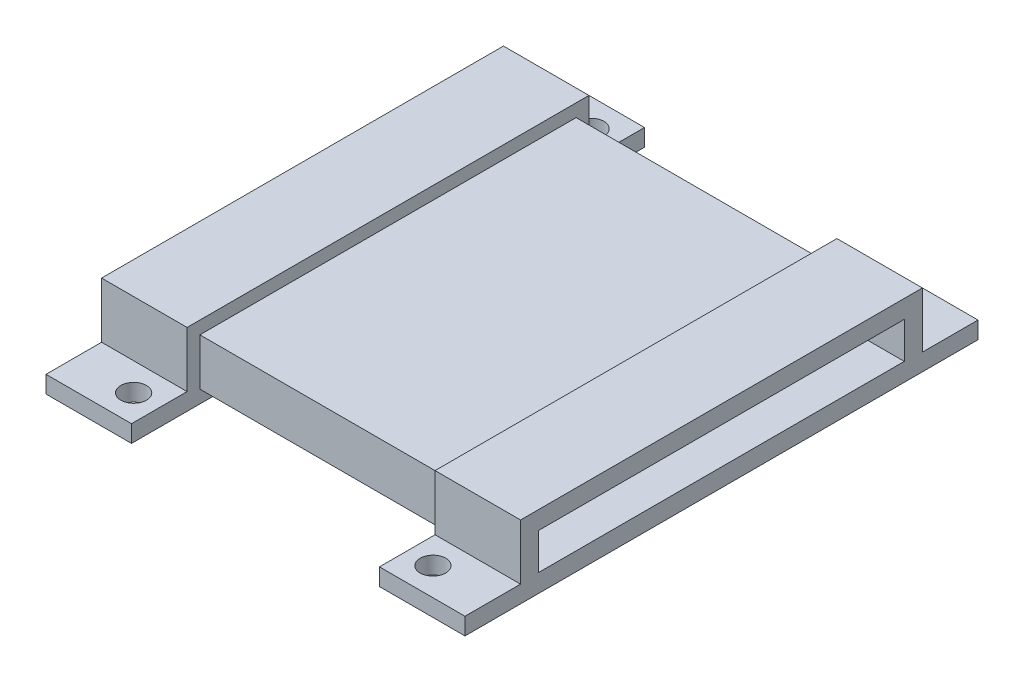
ISO-10303-21;
HEADER;
FILE_DESCRIPTION(('STEP AP214'),'2;1');
FILE_NAME('part.step','',(''),(''),'','','');
FILE_SCHEMA(('AUTOMOTIVE_DESIGN { 1 0 10303 214 1 1 1 1 }'));
ENDSEC;
DATA;
#1=APPLICATION_CONTEXT('core data for automotive mechanical design processes');
#2=APPLICATION_PROTOCOL_DEFINITION('international standard','automotive_design',2000,#1);
#3=PRODUCT_CONTEXT('',#1,'mechanical');
#4=PRODUCT('Part','Part','',(#3));
#5=PRODUCT_RELATED_PRODUCT_CATEGORY('part','',(#4));
#6=PRODUCT_DEFINITION_FORMATION('','',#4);
#7=PRODUCT_DEFINITION_CONTEXT('part definition',#1,'design');
#8=PRODUCT_DEFINITION('design','',#6,#7);
#9=PRODUCT_DEFINITION_SHAPE('','',#8);
#10=(LENGTH_UNIT() NAMED_UNIT(*) SI_UNIT(.MILLI.,.METRE.));
#11=(NAMED_UNIT(*) PLANE_ANGLE_UNIT() SI_UNIT($,.RADIAN.));
#12=(NAMED_UNIT(*) SI_UNIT($,.STERADIAN.) SOLID_ANGLE_UNIT());
#13=UNCERTAINTY_MEASURE_WITH_UNIT(LENGTH_MEASURE(1.E-05),#10,'distance_accuracy_value','');
#14=(GEOMETRIC_REPRESENTATION_CONTEXT(3) GLOBAL_UNCERTAINTY_ASSIGNED_CONTEXT((#13)) GLOBAL_UNIT_ASSIGNED_CONTEXT((#10,
#11,#12)) REPRESENTATION_CONTEXT('',''));
#15=CARTESIAN_POINT('',(0.,0.,0.));
#16=DIRECTION('',(0.,0.,1.));
#17=DIRECTION('',(1.,0.,0.));
#18=AXIS2_PLACEMENT_3D('',#15,#16,#17);
#19=CARTESIAN_POINT('',(-52.3559533834828,15.,-34.4979265643678));
#20=DIRECTION('',(0.,0.,1.));
#21=DIRECTION('',(1.,0.,0.));
#22=AXIS2_PLACEMENT_3D('',#19,#20,#21);
#23=PLANE('',#22);
#24=DIRECTION('',(0.,1.,0.));
#25=VECTOR('',#24,1.);
#26=CARTESIAN_POINT('',(-13.3559533834828,15.,-34.4979265643678));
#27=LINE('',#26,#25);
#28=CARTESIAN_POINT('',(-13.3559533834828,0.,-34.4979265643679));
#29=VERTEX_POINT('',#28);
#30=CARTESIAN_POINT('',(-13.3559533834828,2.,-34.4979265643678));
#31=VERTEX_POINT('',#30);
#32=EDGE_CURVE('E240',#29,#31,#27,.T.);
#33=ORIENTED_EDGE('',*,*,#32,.T.);
#34=DIRECTION('',(-1.,0.,0.));
#35=VECTOR('',#34,1.);
#36=CARTESIAN_POINT('',(1.64404661651728,2.,-34.4979265643678));
#37=LINE('',#36,#35);
#38=CARTESIAN_POINT('',(-3.35595338348275,2.,-34.4979265643678));
#39=VERTEX_POINT('',#38);
#40=EDGE_CURVE('E344',#39,#31,#37,.T.);
#41=ORIENTED_EDGE('',*,*,#40,.F.);
#42=DIRECTION('',(0.,-1.,0.));
#43=VECTOR('',#42,1.);
#44=CARTESIAN_POINT('',(-3.35595338348275,15.,-34.4979265643678));
#45=LINE('',#44,#43);
#46=CARTESIAN_POINT('',(-3.35595338348275,0.,-34.4979265643678));
#47=VERTEX_POINT('',#46);
#48=EDGE_CURVE('E369',#39,#47,#45,.T.);
#49=ORIENTED_EDGE('',*,*,#48,.T.);
#50=DIRECTION('',(-1.,0.,0.));
#51=VECTOR('',#50,1.);
#52=CARTESIAN_POINT('',(-52.3559533834828,0.,-34.4979265643678));
#53=LINE('',#52,#51);
#54=EDGE_CURVE('E363',#47,#29,#53,.T.);
#55=ORIENTED_EDGE('',*,*,#54,.T.);
#56=EDGE_LOOP('',(#33,#41,#49,#55));
#57=FACE_BOUND('',#56,.T.);
#58=ADVANCED_FACE('F30',(#57),#23,.F.);
#59=CARTESIAN_POINT('',(1.64404661651728,2.,-34.4979265643678));
#60=DIRECTION('',(0.,-1.,0.));
#61=DIRECTION('',(0.,0.,-1.));
#62=AXIS2_PLACEMENT_3D('',#59,#60,#61);
#63=PLANE('',#62);
#64=CARTESIAN_POINT('',(-10.3559533834828,2.,-31.2479265643678));
#65=DIRECTION('',(0.,-1.,0.));
#66=DIRECTION('',(0.,0.,-1.));
#67=AXIS2_PLACEMENT_3D('',#64,#65,#66);
#68=CIRCLE('',#67,1.5);
#69=CARTESIAN_POINT('',(-10.3559533834828,2.,-32.7479265643678));
#70=VERTEX_POINT('',#69);
#71=EDGE_CURVE('E322',#70,#70,#68,.T.);
#72=ORIENTED_EDGE('',*,*,#71,.T.);
#73=EDGE_LOOP('',(#72));
#74=FACE_BOUND('',#73,.T.);
#75=ORIENTED_EDGE('',*,*,#40,.T.);
#76=DIRECTION('',(0.,0.,-1.));
#77=VECTOR('',#76,1.);
#78=CARTESIAN_POINT('',(-13.3559533834828,2.,-27.4979265643678));
#79=LINE('',#78,#77);
#80=CARTESIAN_POINT('',(-13.3559533834828,2.,-27.9979265643678));
#81=VERTEX_POINT('',#80);
#82=EDGE_CURVE('E219',#81,#31,#79,.T.);
#83=ORIENTED_EDGE('',*,*,#82,.F.);
#84=DIRECTION('',(-1.,0.,0.));
#85=VECTOR('',#84,1.);
#86=CARTESIAN_POINT('',(1.64404661651728,2.,-27.9979265643678));
#87=LINE('',#86,#85);
#88=CARTESIAN_POINT('',(-3.35595338348275,2.,-27.9979265643678));
#89=VERTEX_POINT('',#88);
#90=EDGE_CURVE('E339',#89,#81,#87,.T.);
#91=ORIENTED_EDGE('',*,*,#90,.F.);
#92=DIRECTION('',(0.,0.,1.));
#93=VECTOR('',#92,1.);
#94=CARTESIAN_POINT('',(-3.35595338348275,2.,25.5020734356322));
#95=LINE('',#94,#93);
#96=EDGE_CURVE('E349',#39,#89,#95,.T.);
#97=ORIENTED_EDGE('',*,*,#96,.F.);
#98=EDGE_LOOP('',(#75,#83,#91,#97));
#99=FACE_BOUND('',#98,.T.);
#100=ADVANCED_FACE('F415',(#74,#99),#63,.F.);
#101=CARTESIAN_POINT('',(-52.3559533834828,15.,25.5020734356322));
#102=DIRECTION('',(0.,0.,-1.));
#103=DIRECTION('',(-1.,0.,0.));
#104=AXIS2_PLACEMENT_3D('',#101,#102,#103);
#105=PLANE('',#104);
#106=DIRECTION('',(0.,1.,0.));
#107=VECTOR('',#106,1.);
#108=CARTESIAN_POINT('',(-42.3559533834828,15.,25.5020734356322));
#109=LINE('',#108,#107);
#110=CARTESIAN_POINT('',(-42.3559533834828,0.,25.5020734356322));
#111=VERTEX_POINT('',#110);
#112=CARTESIAN_POINT('',(-42.3559533834828,2.,25.5020734356322));
#113=VERTEX_POINT('',#112);
#114=EDGE_CURVE('E249',#111,#113,#109,.T.);
#115=ORIENTED_EDGE('',*,*,#114,.T.);
#116=DIRECTION('',(-1.,0.,0.));
#117=VECTOR('',#116,1.);
#118=CARTESIAN_POINT('',(1.64404661651728,2.,25.5020734356322));
#119=LINE('',#118,#117);
#120=CARTESIAN_POINT('',(-52.3559533834828,2.,25.5020734356322));
#121=VERTEX_POINT('',#120);
#122=EDGE_CURVE('E310',#113,#121,#119,.T.);
#123=ORIENTED_EDGE('',*,*,#122,.T.);
#124=DIRECTION('',(0.,-1.,0.));
#125=VECTOR('',#124,1.);
#126=CARTESIAN_POINT('',(-52.3559533834828,15.,25.5020734356322));
#127=LINE('',#126,#125);
#128=CARTESIAN_POINT('',(-52.3559533834828,0.,25.5020734356322));
#129=VERTEX_POINT('',#128);
#130=EDGE_CURVE('E374',#121,#129,#127,.T.);
#131=ORIENTED_EDGE('',*,*,#130,.T.);
#132=DIRECTION('',(1.,0.,0.));
#133=VECTOR('',#132,1.);
#134=CARTESIAN_POINT('',(-52.3559533834828,0.,25.5020734356322));
#135=LINE('',#134,#133);
#136=EDGE_CURVE('E356',#129,#111,#135,.T.);
#137=ORIENTED_EDGE('',*,*,#136,.T.);
#138=EDGE_LOOP('',(#115,#123,#131,#137));
#139=FACE_BOUND('',#138,.T.);
#140=ADVANCED_FACE('F422',(#139),#105,.F.);
#141=CARTESIAN_POINT('',(1.64404661651728,2.,25.5020734356322));
#142=DIRECTION('',(0.,-1.,0.));
#143=DIRECTION('',(0.,0.,-1.));
#144=AXIS2_PLACEMENT_3D('',#141,#142,#143);
#145=PLANE('',#144);
#146=CARTESIAN_POINT('',(-45.3559533834828,2.,22.2520734356322));
#147=DIRECTION('',(0.,-1.,0.));
#148=DIRECTION('',(0.,0.,-1.));
#149=AXIS2_PLACEMENT_3D('',#146,#147,#148);
#150=CIRCLE('',#149,1.5);
#151=CARTESIAN_POINT('',(-45.3559533834828,2.,20.7520734356322));
#152=VERTEX_POINT('',#151);
#153=EDGE_CURVE('E314',#152,#152,#150,.F.);
#154=ORIENTED_EDGE('',*,*,#153,.F.);
#155=EDGE_LOOP('',(#154));
#156=FACE_BOUND('',#155,.T.);
#157=ORIENTED_EDGE('',*,*,#122,.F.);
#158=DIRECTION('',(0.,0.,1.));
#159=VECTOR('',#158,1.);
#160=CARTESIAN_POINT('',(-42.3559533834828,2.,18.5020734356321));
#161=LINE('',#160,#159);
#162=CARTESIAN_POINT('',(-42.3559533834828,2.,19.0020734356322));
#163=VERTEX_POINT('',#162);
#164=EDGE_CURVE('E225',#163,#113,#161,.T.);
#165=ORIENTED_EDGE('',*,*,#164,.F.);
#166=DIRECTION('',(-1.,0.,0.));
#167=VECTOR('',#166,1.);
#168=CARTESIAN_POINT('',(1.64404661651728,2.,19.0020734356322));
#169=LINE('',#168,#167);
#170=CARTESIAN_POINT('',(-52.3559533834828,2.,19.0020734356322));
#171=VERTEX_POINT('',#170);
#172=EDGE_CURVE('E305',#163,#171,#169,.T.);
#173=ORIENTED_EDGE('',*,*,#172,.T.);
#174=DIRECTION('',(0.,0.,1.));
#175=VECTOR('',#174,1.);
#176=CARTESIAN_POINT('',(-52.3559533834828,2.,25.5020734356322));
#177=LINE('',#176,#175);
#178=EDGE_CURVE('E302',#171,#121,#177,.T.);
#179=ORIENTED_EDGE('',*,*,#178,.T.);
#180=EDGE_LOOP('',(#157,#165,#173,#179));
#181=FACE_BOUND('',#180,.T.);
#182=ADVANCED_FACE('F464',(#156,#181),#145,.F.);
#183=CARTESIAN_POINT('',(1.64404661651728,15.,19.0020734356322));
#184=DIRECTION('',(0.,0.,-1.));
#185=DIRECTION('',(-1.,0.,0.));
#186=AXIS2_PLACEMENT_3D('',#183,#184,#185);
#187=PLANE('',#186);
#188=ORIENTED_EDGE('',*,*,#172,.F.);
#189=DIRECTION('',(0.,-1.,0.));
#190=VECTOR('',#189,1.);
#191=CARTESIAN_POINT('',(-42.3559533834828,-31.0730076798941,19.0020734356322));
#192=LINE('',#191,#190);
#193=CARTESIAN_POINT('',(-42.3559533834828,8.5,19.0020734356322));
#194=VERTEX_POINT('',#193);
#195=EDGE_CURVE('E265',#194,#163,#192,.T.);
#196=ORIENTED_EDGE('',*,*,#195,.F.);
#197=DIRECTION('',(1.,0.,0.));
#198=VECTOR('',#197,1.);
#199=CARTESIAN_POINT('',(-27.8559533834828,8.5,19.0020734356322));
#200=LINE('',#199,#198);
#201=CARTESIAN_POINT('',(-52.3559533834828,8.5,19.0020734356322));
#202=VERTEX_POINT('',#201);
#203=EDGE_CURVE('E262',#202,#194,#200,.T.);
#204=ORIENTED_EDGE('',*,*,#203,.F.);
#205=DIRECTION('',(0.,-1.,0.));
#206=VECTOR('',#205,1.);
#207=CARTESIAN_POINT('',(-52.3559533834828,15.,19.0020734356322));
#208=LINE('',#207,#206);
#209=EDGE_CURVE('E299',#202,#171,#208,.T.);
#210=ORIENTED_EDGE('',*,*,#209,.T.);
#211=EDGE_LOOP('',(#188,#196,#204,#210));
#212=FACE_BOUND('',#211,.T.);
#213=ADVANCED_FACE('F460',(#212),#187,.F.);
#214=CARTESIAN_POINT('',(-42.3559533834828,1.5,49.5020734356322));
#215=DIRECTION('',(0.,1.,0.));
#216=DIRECTION('',(-1.,0.,0.));
#217=AXIS2_PLACEMENT_3D('',#214,#215,#216);
#218=PLANE('',#217);
#219=DIRECTION('',(0.,0.,-1.));
#220=VECTOR('',#219,1.);
#221=CARTESIAN_POINT('',(-13.3559533834828,1.5,49.5020734356322));
#222=LINE('',#221,#220);
#223=CARTESIAN_POINT('',(-13.3559533834828,1.5,17.5020734356322));
#224=VERTEX_POINT('',#223);
#225=CARTESIAN_POINT('',(-13.3559533834828,1.5,-26.4979265643678));
#226=VERTEX_POINT('',#225);
#227=EDGE_CURVE('E238',#224,#226,#222,.T.);
#228=ORIENTED_EDGE('',*,*,#227,.F.);
#229=DIRECTION('',(-1.,0.,0.));
#230=VECTOR('',#229,1.);
#231=CARTESIAN_POINT('',(-42.3559533834828,1.5,17.5020734356322));
#232=LINE('',#231,#230);
#233=CARTESIAN_POINT('',(-42.3559533834828,1.5,17.5020734356322));
#234=VERTEX_POINT('',#233);
#235=EDGE_CURVE('E389',#224,#234,#232,.T.);
#236=ORIENTED_EDGE('',*,*,#235,.T.);
#237=DIRECTION('',(0.,0.,-1.));
#238=VECTOR('',#237,1.);
#239=CARTESIAN_POINT('',(-42.3559533834828,1.5,49.5020734356322));
#240=LINE('',#239,#238);
#241=CARTESIAN_POINT('',(-42.3559533834828,1.5,-26.4979265643678));
#242=VERTEX_POINT('',#241);
#243=EDGE_CURVE('E236',#234,#242,#240,.T.);
#244=ORIENTED_EDGE('',*,*,#243,.T.);
#245=DIRECTION('',(-1.,0.,0.));
#246=VECTOR('',#245,1.);
#247=CARTESIAN_POINT('',(-13.3559533834828,1.5,-26.4979265643678));
#248=LINE('',#247,#246);
#249=EDGE_CURVE('E376',#226,#242,#248,.T.);
#250=ORIENTED_EDGE('',*,*,#249,.F.);
#251=EDGE_LOOP('',(#228,#236,#244,#250));
#252=FACE_BOUND('',#251,.T.);
#253=ADVANCED_FACE('F473',(#252),#218,.F.);
#254=CARTESIAN_POINT('',(-52.3559533834828,0.,-34.4979265643678));
#255=DIRECTION('',(0.,-1.,0.));
#256=DIRECTION('',(0.,0.,-1.));
#257=AXIS2_PLACEMENT_3D('',#254,#255,#256);
#258=PLANE('',#257);
#259=DIRECTION('',(0.,0.,-1.));
#260=VECTOR('',#259,1.);
#261=CARTESIAN_POINT('',(-42.3559533834828,0.,-34.4979265643678));
#262=LINE('',#261,#260);
#263=CARTESIAN_POINT('',(-42.3559533834828,0.,-34.4979265643679));
#264=VERTEX_POINT('',#263);
#265=EDGE_CURVE('E257',#111,#264,#262,.T.);
#266=ORIENTED_EDGE('',*,*,#265,.F.);
#267=ORIENTED_EDGE('',*,*,#136,.F.);
#268=DIRECTION('',(0.,0.,1.));
#269=VECTOR('',#268,1.);
#270=CARTESIAN_POINT('',(-52.3559533834828,0.,25.5020734356322));
#271=LINE('',#270,#269);
#272=CARTESIAN_POINT('',(-52.3559533834828,0.,-34.4979265643678));
#273=VERTEX_POINT('',#272);
#274=EDGE_CURVE('E352',#273,#129,#271,.T.);
#275=ORIENTED_EDGE('',*,*,#274,.F.);
#276=EDGE_CURVE('E362',#264,#273,#53,.T.);
#277=ORIENTED_EDGE('',*,*,#276,.F.);
#278=EDGE_LOOP('',(#266,#267,#275,#277));
#279=FACE_BOUND('',#278,.T.);
#280=CARTESIAN_POINT('',(-45.3559533834828,0.,22.2520734356322));
#281=DIRECTION('',(0.,-1.,0.));
#282=DIRECTION('',(0.,0.,-1.));
#283=AXIS2_PLACEMENT_3D('',#280,#281,#282);
#284=CIRCLE('',#283,1.5);
#285=CARTESIAN_POINT('',(-45.3559533834828,0.,20.7520734356322));
#286=VERTEX_POINT('',#285);
#287=EDGE_CURVE('E335',#286,#286,#284,.T.);
#288=ORIENTED_EDGE('',*,*,#287,.F.);
#289=EDGE_LOOP('',(#288));
#290=FACE_BOUND('',#289,.T.);
#291=CARTESIAN_POINT('',(-45.3559533834828,0.,-31.2479265643678));
#292=DIRECTION('',(0.,-1.,0.));
#293=DIRECTION('',(0.,0.,-1.));
#294=AXIS2_PLACEMENT_3D('',#291,#292,#293);
#295=CIRCLE('',#294,1.5);
#296=CARTESIAN_POINT('',(-45.3559533834828,0.,-32.7479265643678));
#297=VERTEX_POINT('',#296);
#298=EDGE_CURVE('E327',#297,#297,#295,.T.);
#299=ORIENTED_EDGE('',*,*,#298,.F.);
#300=EDGE_LOOP('',(#299));
#301=FACE_BOUND('',#300,.T.);
#302=ADVANCED_FACE('F436',(#279,#290,#301),#258,.T.);
#303=CARTESIAN_POINT('',(1.64404661651728,15.,-27.9979265643678));
#304=DIRECTION('',(0.,0.,1.));
#305=DIRECTION('',(1.,0.,0.));
#306=AXIS2_PLACEMENT_3D('',#303,#304,#305);
#307=PLANE('',#306);
#308=ORIENTED_EDGE('',*,*,#90,.T.);
#309=DIRECTION('',(0.,-1.,0.));
#310=VECTOR('',#309,1.);
#311=CARTESIAN_POINT('',(-13.3559533834828,15.,-27.9979265643678));
#312=LINE('',#311,#310);
#313=CARTESIAN_POINT('',(-13.3559533834828,8.5,-27.9979265643678));
#314=VERTEX_POINT('',#313);
#315=EDGE_CURVE('E293',#314,#81,#312,.T.);
#316=ORIENTED_EDGE('',*,*,#315,.F.);
#317=DIRECTION('',(1.,0.,0.));
#318=VECTOR('',#317,1.);
#319=CARTESIAN_POINT('',(1.64404661651728,8.5,-27.9979265643678));
#320=LINE('',#319,#318);
#321=CARTESIAN_POINT('',(-3.35595338348275,8.5,-27.9979265643678));
#322=VERTEX_POINT('',#321);
#323=EDGE_CURVE('E296',#314,#322,#320,.T.);
#324=ORIENTED_EDGE('',*,*,#323,.T.);
#325=DIRECTION('',(0.,1.,0.));
#326=VECTOR('',#325,1.);
#327=CARTESIAN_POINT('',(-3.35595338348275,15.,-27.9979265643678));
#328=LINE('',#327,#326);
#329=EDGE_CURVE('E342',#89,#322,#328,.T.);
#330=ORIENTED_EDGE('',*,*,#329,.F.);
#331=EDGE_LOOP('',(#308,#316,#324,#330));
#332=FACE_BOUND('',#331,.T.);
#333=ADVANCED_FACE('F472',(#332),#307,.F.);
#334=CARTESIAN_POINT('',(-52.3559533834828,15.,25.5020734356322));
#335=DIRECTION('',(1.,0.,0.));
#336=DIRECTION('',(0.,0.,-1.));
#337=AXIS2_PLACEMENT_3D('',#334,#335,#336);
#338=PLANE('',#337);
#339=DIRECTION('',(0.,0.,-1.));
#340=VECTOR('',#339,1.);
#341=CARTESIAN_POINT('',(-52.3559533834828,6.37867965644035,-25.8766062208082));
#342=LINE('',#341,#340);
#343=CARTESIAN_POINT('',(-52.3559533834828,6.37867965644035,16.8807530920725));
#344=VERTEX_POINT('',#343);
#345=CARTESIAN_POINT('',(-52.3559533834828,6.37867965644035,-25.8766062208082));
#346=VERTEX_POINT('',#345);
#347=EDGE_CURVE('E203',#344,#346,#342,.T.);
#348=ORIENTED_EDGE('',*,*,#347,.F.);
#349=DIRECTION('',(0.,1.,0.));
#350=VECTOR('',#349,1.);
#351=CARTESIAN_POINT('',(-52.3559533834828,6.37867965644035,16.8807530920725));
#352=LINE('',#351,#350);
#353=CARTESIAN_POINT('',(-52.3559533834828,2.12132034355964,16.8807530920725));
#354=VERTEX_POINT('',#353);
#355=EDGE_CURVE('E45',#354,#344,#352,.T.);
#356=ORIENTED_EDGE('',*,*,#355,.F.);
#357=DIRECTION('',(0.,0.,1.));
#358=VECTOR('',#357,1.);
#359=CARTESIAN_POINT('',(-52.3559533834828,2.12132034355964,-25.8766062208082));
#360=LINE('',#359,#358);
#361=CARTESIAN_POINT('',(-52.3559533834828,2.12132034355964,-25.8766062208082));
#362=VERTEX_POINT('',#361);
#363=EDGE_CURVE('E209',#362,#354,#360,.T.);
#364=ORIENTED_EDGE('',*,*,#363,.F.);
#365=DIRECTION('',(0.,-1.,0.));
#366=VECTOR('',#365,1.);
#367=CARTESIAN_POINT('',(-52.3559533834828,6.37867965644035,-25.8766062208082));
#368=LINE('',#367,#366);
#369=EDGE_CURVE('E194',#346,#362,#368,.T.);
#370=ORIENTED_EDGE('',*,*,#369,.F.);
#371=EDGE_LOOP('',(#348,#356,#364,#370));
#372=FACE_BOUND('',#371,.T.);
#373=ORIENTED_EDGE('',*,*,#209,.F.);
#374=DIRECTION('',(0.,0.,1.));
#375=VECTOR('',#374,1.);
#376=CARTESIAN_POINT('',(-52.3559533834828,8.5,-34.9979265643679));
#377=LINE('',#376,#375);
#378=CARTESIAN_POINT('',(-52.3559533834828,8.5,-27.9979265643678));
#379=VERTEX_POINT('',#378);
#380=EDGE_CURVE('E286',#379,#202,#377,.T.);
#381=ORIENTED_EDGE('',*,*,#380,.F.);
#382=DIRECTION('',(0.,1.,0.));
#383=VECTOR('',#382,1.);
#384=CARTESIAN_POINT('',(-52.3559533834828,15.,-27.9979265643678));
#385=LINE('',#384,#383);
#386=CARTESIAN_POINT('',(-52.3559533834828,2.,-27.9979265643678));
#387=VERTEX_POINT('',#386);
#388=EDGE_CURVE('E334',#387,#379,#385,.T.);
#389=ORIENTED_EDGE('',*,*,#388,.F.);
#390=DIRECTION('',(0.,0.,1.));
#391=VECTOR('',#390,1.);
#392=CARTESIAN_POINT('',(-52.3559533834828,2.,-34.4979265643678));
#393=LINE('',#392,#391);
#394=CARTESIAN_POINT('',(-52.3559533834828,2.,-34.4979265643678));
#395=VERTEX_POINT('',#394);
#396=EDGE_CURVE('E331',#395,#387,#393,.T.);
#397=ORIENTED_EDGE('',*,*,#396,.F.);
#398=DIRECTION('',(0.,-1.,0.));
#399=VECTOR('',#398,1.);
#400=CARTESIAN_POINT('',(-52.3559533834828,15.,-34.4979265643678));
#401=LINE('',#400,#399);
#402=EDGE_CURVE('E366',#395,#273,#401,.T.);
#403=ORIENTED_EDGE('',*,*,#402,.T.);
#404=ORIENTED_EDGE('',*,*,#274,.T.);
#405=ORIENTED_EDGE('',*,*,#130,.F.);
#406=ORIENTED_EDGE('',*,*,#178,.F.);
#407=EDGE_LOOP('',(#373,#381,#389,#397,#403,#404,#405,#406));
#408=FACE_BOUND('',#407,.T.);
#409=ADVANCED_FACE('F32',(#372,#408),#338,.F.);
#410=CARTESIAN_POINT('',(-3.35595338348275,2.,25.5020734356322));
#411=VERTEX_POINT('',#410);
#412=CARTESIAN_POINT('',(-13.3559533834828,2.,25.5020734356322));
#413=VERTEX_POINT('',#412);
#414=EDGE_CURVE('E306',#411,#413,#119,.T.);
#415=ORIENTED_EDGE('',*,*,#414,.T.);
#416=DIRECTION('',(0.,-1.,0.));
#417=VECTOR('',#416,1.);
#418=CARTESIAN_POINT('',(-13.3559533834828,15.,25.5020734356322));
#419=LINE('',#418,#417);
#420=CARTESIAN_POINT('',(-13.3559533834828,0.,25.5020734356322));
#421=VERTEX_POINT('',#420);
#422=EDGE_CURVE('E243',#413,#421,#419,.T.);
#423=ORIENTED_EDGE('',*,*,#422,.T.);
#424=CARTESIAN_POINT('',(-3.35595338348275,0.,25.5020734356322));
#425=VERTEX_POINT('',#424);
#426=EDGE_CURVE('E355',#421,#425,#135,.T.);
#427=ORIENTED_EDGE('',*,*,#426,.T.);
#428=DIRECTION('',(0.,-1.,0.));
#429=VECTOR('',#428,1.);
#430=CARTESIAN_POINT('',(-3.35595338348275,15.,25.5020734356322));
#431=LINE('',#430,#429);
#432=EDGE_CURVE('E371',#411,#425,#431,.T.);
#433=ORIENTED_EDGE('',*,*,#432,.F.);
#434=EDGE_LOOP('',(#415,#423,#427,#433));
#435=FACE_BOUND('',#434,.T.);
#436=ADVANCED_FACE('F437',(#435),#105,.F.);
#437=CARTESIAN_POINT('',(-3.35595338348275,15.,25.5020734356322));
#438=DIRECTION('',(-1.,0.,0.));
#439=DIRECTION('',(0.,0.,1.));
#440=AXIS2_PLACEMENT_3D('',#437,#438,#439);
#441=PLANE('',#440);
#442=DIRECTION('',(0.,0.,1.));
#443=VECTOR('',#442,1.);
#444=CARTESIAN_POINT('',(-3.35595338348275,2.12132034355964,25.5020734356322));
#445=LINE('',#444,#443);
#446=CARTESIAN_POINT('',(-3.35595338348275,2.12132034355964,-25.8766062208082));
#447=VERTEX_POINT('',#446);
#448=CARTESIAN_POINT('',(-3.35595338348275,2.12132034355964,16.8807530920725));
#449=VERTEX_POINT('',#448);
#450=EDGE_CURVE('E38',#447,#449,#445,.T.);
#451=ORIENTED_EDGE('',*,*,#450,.T.);
#452=DIRECTION('',(0.,1.,0.));
#453=VECTOR('',#452,1.);
#454=CARTESIAN_POINT('',(-3.35595338348275,15.,16.8807530920725));
#455=LINE('',#454,#453);
#456=CARTESIAN_POINT('',(-3.35595338348275,6.37867965644035,16.8807530920725));
#457=VERTEX_POINT('',#456);
#458=EDGE_CURVE('E11',#449,#457,#455,.T.);
#459=ORIENTED_EDGE('',*,*,#458,.T.);
#460=DIRECTION('',(0.,0.,-1.));
#461=VECTOR('',#460,1.);
#462=CARTESIAN_POINT('',(-3.35595338348275,6.37867965644035,25.5020734356322));
#463=LINE('',#462,#461);
#464=CARTESIAN_POINT('',(-3.35595338348275,6.37867965644035,-25.8766062208082));
#465=VERTEX_POINT('',#464);
#466=EDGE_CURVE('E392',#457,#465,#463,.T.);
#467=ORIENTED_EDGE('',*,*,#466,.T.);
#468=DIRECTION('',(0.,-1.,0.));
#469=VECTOR('',#468,1.);
#470=CARTESIAN_POINT('',(-3.35595338348275,15.,-25.8766062208082));
#471=LINE('',#470,#469);
#472=EDGE_CURVE('E197',#465,#447,#471,.T.);
#473=ORIENTED_EDGE('',*,*,#472,.T.);
#474=EDGE_LOOP('',(#451,#459,#467,#473));
#475=FACE_BOUND('',#474,.T.);
#476=ORIENTED_EDGE('',*,*,#329,.T.);
#477=DIRECTION('',(0.,0.,1.));
#478=VECTOR('',#477,1.);
#479=CARTESIAN_POINT('',(-3.35595338348275,8.5,-34.9979265643679));
#480=LINE('',#479,#478);
#481=CARTESIAN_POINT('',(-3.35595338348275,8.5,19.0020734356322));
#482=VERTEX_POINT('',#481);
#483=EDGE_CURVE('E272',#322,#482,#480,.T.);
#484=ORIENTED_EDGE('',*,*,#483,.T.);
#485=DIRECTION('',(0.,-1.,0.));
#486=VECTOR('',#485,1.);
#487=CARTESIAN_POINT('',(-3.35595338348275,15.,19.0020734356322));
#488=LINE('',#487,#486);
#489=CARTESIAN_POINT('',(-3.35595338348275,2.,19.0020734356322));
#490=VERTEX_POINT('',#489);
#491=EDGE_CURVE('E320',#482,#490,#488,.T.);
#492=ORIENTED_EDGE('',*,*,#491,.T.);
#493=DIRECTION('',(0.,0.,1.));
#494=VECTOR('',#493,1.);
#495=CARTESIAN_POINT('',(-3.35595338348275,2.,25.5020734356322));
#496=LINE('',#495,#494);
#497=EDGE_CURVE('E317',#490,#411,#496,.T.);
#498=ORIENTED_EDGE('',*,*,#497,.T.);
#499=ORIENTED_EDGE('',*,*,#432,.T.);
#500=DIRECTION('',(0.,0.,-1.));
#501=VECTOR('',#500,1.);
#502=CARTESIAN_POINT('',(-3.35595338348275,0.,25.5020734356322));
#503=LINE('',#502,#501);
#504=EDGE_CURVE('E359',#425,#47,#503,.T.);
#505=ORIENTED_EDGE('',*,*,#504,.T.);
#506=ORIENTED_EDGE('',*,*,#48,.F.);
#507=ORIENTED_EDGE('',*,*,#96,.T.);
#508=EDGE_LOOP('',(#476,#484,#492,#498,#499,#505,#506,#507));
#509=FACE_BOUND('',#508,.T.);
#510=ADVANCED_FACE('F396',(#475,#509),#441,.F.);
#511=CARTESIAN_POINT('',(-42.3559533834828,2.,-34.4979265643678));
#512=VERTEX_POINT('',#511);
#513=EDGE_CURVE('E338',#512,#395,#37,.T.);
#514=ORIENTED_EDGE('',*,*,#513,.F.);
#515=DIRECTION('',(0.,-1.,0.));
#516=VECTOR('',#515,1.);
#517=CARTESIAN_POINT('',(-42.3559533834828,15.,-34.4979265643678));
#518=LINE('',#517,#516);
#519=EDGE_CURVE('E246',#512,#264,#518,.T.);
#520=ORIENTED_EDGE('',*,*,#519,.T.);
#521=ORIENTED_EDGE('',*,*,#276,.T.);
#522=ORIENTED_EDGE('',*,*,#402,.F.);
#523=EDGE_LOOP('',(#514,#520,#521,#522));
#524=FACE_BOUND('',#523,.T.);
#525=ADVANCED_FACE('F418',(#524),#23,.F.);
#526=DIRECTION('',(0.,0.,1.));
#527=VECTOR('',#526,1.);
#528=CARTESIAN_POINT('',(-13.3559533834828,0.,-34.4979265643678));
#529=LINE('',#528,#527);
#530=EDGE_CURVE('E260',#29,#421,#529,.T.);
#531=ORIENTED_EDGE('',*,*,#530,.F.);
#532=ORIENTED_EDGE('',*,*,#54,.F.);
#533=ORIENTED_EDGE('',*,*,#504,.F.);
#534=ORIENTED_EDGE('',*,*,#426,.F.);
#535=EDGE_LOOP('',(#531,#532,#533,#534));
#536=FACE_BOUND('',#535,.T.);
#537=CARTESIAN_POINT('',(-10.3559533834828,0.,-31.2479265643678));
#538=DIRECTION('',(0.,-1.,0.));
#539=DIRECTION('',(0.,0.,-1.));
#540=AXIS2_PLACEMENT_3D('',#537,#538,#539);
#541=CIRCLE('',#540,1.5);
#542=CARTESIAN_POINT('',(-10.3559533834828,0.,-32.7479265643678));
#543=VERTEX_POINT('',#542);
#544=EDGE_CURVE('E323',#543,#543,#541,.T.);
#545=ORIENTED_EDGE('',*,*,#544,.F.);
#546=EDGE_LOOP('',(#545));
#547=FACE_BOUND('',#546,.T.);
#548=CARTESIAN_POINT('',(-10.3559533834828,0.,22.2520734356322));
#549=DIRECTION('',(0.,-1.,0.));
#550=DIRECTION('',(0.,0.,-1.));
#551=AXIS2_PLACEMENT_3D('',#548,#549,#550);
#552=CIRCLE('',#551,1.5);
#553=CARTESIAN_POINT('',(-10.3559533834828,0.,20.7520734356322));
#554=VERTEX_POINT('',#553);
#555=EDGE_CURVE('E330',#554,#554,#552,.T.);
#556=ORIENTED_EDGE('',*,*,#555,.F.);
#557=EDGE_LOOP('',(#556));
#558=FACE_BOUND('',#557,.T.);
#559=ADVANCED_FACE('F429',(#536,#547,#558),#258,.T.);
#560=CARTESIAN_POINT('',(-45.3559533834828,2.,-31.2479265643678));
#561=DIRECTION('',(0.,-1.,0.));
#562=DIRECTION('',(0.,0.,-1.));
#563=AXIS2_PLACEMENT_3D('',#560,#561,#562);
#564=CIRCLE('',#563,1.5);
#565=CARTESIAN_POINT('',(-45.3559533834828,2.,-32.7479265643678));
#566=VERTEX_POINT('',#565);
#567=EDGE_CURVE('E326',#566,#566,#564,.T.);
#568=ORIENTED_EDGE('',*,*,#567,.T.);
#569=EDGE_LOOP('',(#568));
#570=FACE_BOUND('',#569,.T.);
#571=CARTESIAN_POINT('',(-42.3559533834828,2.,-27.9979265643678));
#572=VERTEX_POINT('',#571);
#573=EDGE_CURVE('E343',#572,#387,#87,.T.);
#574=ORIENTED_EDGE('',*,*,#573,.F.);
#575=DIRECTION('',(0.,0.,-1.));
#576=VECTOR('',#575,1.);
#577=CARTESIAN_POINT('',(-42.3559533834828,2.,-27.4979265643678));
#578=LINE('',#577,#576);
#579=EDGE_CURVE('E216',#572,#512,#578,.T.);
#580=ORIENTED_EDGE('',*,*,#579,.T.);
#581=ORIENTED_EDGE('',*,*,#513,.T.);
#582=ORIENTED_EDGE('',*,*,#396,.T.);
#583=EDGE_LOOP('',(#574,#580,#581,#582));
#584=FACE_BOUND('',#583,.T.);
#585=ADVANCED_FACE('F425',(#570,#584),#63,.F.);
#586=DIRECTION('',(0.,-1.,0.));
#587=VECTOR('',#586,1.);
#588=CARTESIAN_POINT('',(-42.3559533834828,15.,-27.9979265643678));
#589=LINE('',#588,#587);
#590=CARTESIAN_POINT('',(-42.3559533834828,8.5,-27.9979265643678));
#591=VERTEX_POINT('',#590);
#592=EDGE_CURVE('E290',#591,#572,#589,.T.);
#593=ORIENTED_EDGE('',*,*,#592,.T.);
#594=ORIENTED_EDGE('',*,*,#573,.T.);
#595=ORIENTED_EDGE('',*,*,#388,.T.);
#596=DIRECTION('',(1.,0.,0.));
#597=VECTOR('',#596,1.);
#598=CARTESIAN_POINT('',(1.64404661651728,8.5,-27.9979265643678));
#599=LINE('',#598,#597);
#600=EDGE_CURVE('E275',#379,#591,#599,.T.);
#601=ORIENTED_EDGE('',*,*,#600,.T.);
#602=EDGE_LOOP('',(#593,#594,#595,#601));
#603=FACE_BOUND('',#602,.T.);
#604=ADVANCED_FACE('F449',(#603),#307,.F.);
#605=CARTESIAN_POINT('',(-45.3559533834828,-39.,22.2520734356322));
#606=DIRECTION('',(0.,1.,0.));
#607=DIRECTION('',(0.,0.,1.));
#608=AXIS2_PLACEMENT_3D('',#605,#606,#607);
#609=CYLINDRICAL_SURFACE('',#608,1.5);
#610=ORIENTED_EDGE('',*,*,#153,.T.);
#611=EDGE_LOOP('',(#610));
#612=FACE_BOUND('',#611,.T.);
#613=ORIENTED_EDGE('',*,*,#287,.T.);
#614=EDGE_LOOP('',(#613));
#615=FACE_BOUND('',#614,.T.);
#616=ADVANCED_FACE('F490',(#612,#615),#609,.F.);
#617=CARTESIAN_POINT('',(-10.3559533834828,-39.,22.2520734356322));
#618=DIRECTION('',(0.,1.,0.));
#619=DIRECTION('',(0.,0.,1.));
#620=AXIS2_PLACEMENT_3D('',#617,#618,#619);
#621=CYLINDRICAL_SURFACE('',#620,1.5);
#622=CARTESIAN_POINT('',(-10.3559533834828,2.,22.2520734356322));
#623=DIRECTION('',(0.,-1.,0.));
#624=DIRECTION('',(0.,0.,-1.));
#625=AXIS2_PLACEMENT_3D('',#622,#623,#624);
#626=CIRCLE('',#625,1.5);
#627=CARTESIAN_POINT('',(-10.3559533834828,2.,20.7520734356322));
#628=VERTEX_POINT('',#627);
#629=EDGE_CURVE('E309',#628,#628,#626,.F.);
#630=ORIENTED_EDGE('',*,*,#629,.T.);
#631=EDGE_LOOP('',(#630));
#632=FACE_BOUND('',#631,.T.);
#633=ORIENTED_EDGE('',*,*,#555,.T.);
#634=EDGE_LOOP('',(#633));
#635=FACE_BOUND('',#634,.T.);
#636=ADVANCED_FACE('F482',(#632,#635),#621,.F.);
#637=CARTESIAN_POINT('',(-45.3559533834828,-39.,-31.2479265643678));
#638=DIRECTION('',(0.,1.,0.));
#639=DIRECTION('',(0.,0.,1.));
#640=AXIS2_PLACEMENT_3D('',#637,#638,#639);
#641=CYLINDRICAL_SURFACE('',#640,1.5);
#642=ORIENTED_EDGE('',*,*,#298,.T.);
#643=EDGE_LOOP('',(#642));
#644=FACE_BOUND('',#643,.T.);
#645=ORIENTED_EDGE('',*,*,#567,.F.);
#646=EDGE_LOOP('',(#645));
#647=FACE_BOUND('',#646,.T.);
#648=ADVANCED_FACE('F478',(#644,#647),#641,.F.);
#649=CARTESIAN_POINT('',(-10.3559533834828,-39.,-31.2479265643678));
#650=DIRECTION('',(0.,1.,0.));
#651=DIRECTION('',(0.,0.,1.));
#652=AXIS2_PLACEMENT_3D('',#649,#650,#651);
#653=CYLINDRICAL_SURFACE('',#652,1.5);
#654=ORIENTED_EDGE('',*,*,#544,.T.);
#655=EDGE_LOOP('',(#654));
#656=FACE_BOUND('',#655,.T.);
#657=ORIENTED_EDGE('',*,*,#71,.F.);
#658=EDGE_LOOP('',(#657));
#659=FACE_BOUND('',#658,.T.);
#660=ADVANCED_FACE('F481',(#656,#659),#653,.F.);
#661=DIRECTION('',(0.,-1.,0.));
#662=VECTOR('',#661,1.);
#663=CARTESIAN_POINT('',(-13.3559533834828,-31.0730076798941,19.0020734356322));
#664=LINE('',#663,#662);
#665=CARTESIAN_POINT('',(-13.3559533834828,8.5,19.0020734356322));
#666=VERTEX_POINT('',#665);
#667=CARTESIAN_POINT('',(-13.3559533834828,2.,19.0020734356322));
#668=VERTEX_POINT('',#667);
#669=EDGE_CURVE('E269',#666,#668,#664,.T.);
#670=ORIENTED_EDGE('',*,*,#669,.T.);
#671=EDGE_CURVE('E311',#490,#668,#169,.T.);
#672=ORIENTED_EDGE('',*,*,#671,.F.);
#673=ORIENTED_EDGE('',*,*,#491,.F.);
#674=EDGE_CURVE('E266',#666,#482,#200,.T.);
#675=ORIENTED_EDGE('',*,*,#674,.F.);
#676=EDGE_LOOP('',(#670,#672,#673,#675));
#677=FACE_BOUND('',#676,.T.);
#678=ADVANCED_FACE('F501',(#677),#187,.F.);
#679=ORIENTED_EDGE('',*,*,#629,.F.);
#680=EDGE_LOOP('',(#679));
#681=FACE_BOUND('',#680,.T.);
#682=ORIENTED_EDGE('',*,*,#671,.T.);
#683=DIRECTION('',(0.,0.,1.));
#684=VECTOR('',#683,1.);
#685=CARTESIAN_POINT('',(-13.3559533834828,2.,18.5020734356321));
#686=LINE('',#685,#684);
#687=EDGE_CURVE('E222',#668,#413,#686,.T.);
#688=ORIENTED_EDGE('',*,*,#687,.T.);
#689=ORIENTED_EDGE('',*,*,#414,.F.);
#690=ORIENTED_EDGE('',*,*,#497,.F.);
#691=EDGE_LOOP('',(#682,#688,#689,#690));
#692=FACE_BOUND('',#691,.T.);
#693=ADVANCED_FACE('F505',(#681,#692),#145,.F.);
#694=CARTESIAN_POINT('',(-27.8559533834828,8.5,-34.9979265643679));
#695=DIRECTION('',(0.,-1.,0.));
#696=DIRECTION('',(0.,0.,-1.));
#697=AXIS2_PLACEMENT_3D('',#694,#695,#696);
#698=PLANE('',#697);
#699=DIRECTION('',(0.,0.,1.));
#700=VECTOR('',#699,1.);
#701=CARTESIAN_POINT('',(-13.3559533834828,8.5,-34.9979265643679));
#702=LINE('',#701,#700);
#703=EDGE_CURVE('E276',#314,#666,#702,.T.);
#704=ORIENTED_EDGE('',*,*,#703,.T.);
#705=ORIENTED_EDGE('',*,*,#674,.T.);
#706=ORIENTED_EDGE('',*,*,#483,.F.);
#707=ORIENTED_EDGE('',*,*,#323,.F.);
#708=EDGE_LOOP('',(#704,#705,#706,#707));
#709=FACE_BOUND('',#708,.T.);
#710=ADVANCED_FACE('F509',(#709),#698,.F.);
#711=CARTESIAN_POINT('',(-13.3559533834828,-31.0730076798941,-34.9979265643679));
#712=DIRECTION('',(-1.,0.,0.));
#713=DIRECTION('',(0.,0.,1.));
#714=AXIS2_PLACEMENT_3D('',#711,#712,#713);
#715=PLANE('',#714);
#716=ORIENTED_EDGE('',*,*,#315,.T.);
#717=ORIENTED_EDGE('',*,*,#82,.T.);
#718=ORIENTED_EDGE('',*,*,#32,.F.);
#719=ORIENTED_EDGE('',*,*,#530,.T.);
#720=ORIENTED_EDGE('',*,*,#422,.F.);
#721=ORIENTED_EDGE('',*,*,#687,.F.);
#722=ORIENTED_EDGE('',*,*,#669,.F.);
#723=ORIENTED_EDGE('',*,*,#703,.F.);
#724=EDGE_LOOP('',(#716,#717,#718,#719,#720,#721,#722,#723));
#725=FACE_BOUND('',#724,.T.);
#726=DIRECTION('',(0.,1.,0.));
#727=VECTOR('',#726,1.);
#728=CARTESIAN_POINT('',(-13.3559533834828,-10.,17.5020734356322));
#729=LINE('',#728,#727);
#730=CARTESIAN_POINT('',(-13.3559533834828,7.,17.5020734356322));
#731=VERTEX_POINT('',#730);
#732=EDGE_CURVE('E232',#224,#731,#729,.T.);
#733=ORIENTED_EDGE('',*,*,#732,.F.);
#734=ORIENTED_EDGE('',*,*,#227,.T.);
#735=DIRECTION('',(0.,1.,0.));
#736=VECTOR('',#735,1.);
#737=CARTESIAN_POINT('',(-13.3559533834828,-47.,-26.4979265643678));
#738=LINE('',#737,#736);
#739=CARTESIAN_POINT('',(-13.3559533834828,7.,-26.4979265643678));
#740=VERTEX_POINT('',#739);
#741=EDGE_CURVE('E255',#226,#740,#738,.T.);
#742=ORIENTED_EDGE('',*,*,#741,.T.);
#743=DIRECTION('',(0.,0.,1.));
#744=VECTOR('',#743,1.);
#745=CARTESIAN_POINT('',(-13.3559533834828,7.,-34.9979265643679));
#746=LINE('',#745,#744);
#747=EDGE_CURVE('E278',#740,#731,#746,.T.);
#748=ORIENTED_EDGE('',*,*,#747,.T.);
#749=EDGE_LOOP('',(#733,#734,#742,#748));
#750=FACE_BOUND('',#749,.T.);
#751=ADVANCED_FACE('F516',(#725,#750),#715,.T.);
#752=CARTESIAN_POINT('',(-27.8559533834828,7.,-34.9979265643679));
#753=DIRECTION('',(0.,-1.,0.));
#754=DIRECTION('',(0.,0.,-1.));
#755=AXIS2_PLACEMENT_3D('',#752,#753,#754);
#756=PLANE('',#755);
#757=DIRECTION('',(0.,0.,1.));
#758=VECTOR('',#757,1.);
#759=CARTESIAN_POINT('',(-42.3559533834828,7.,-34.9979265643679));
#760=LINE('',#759,#758);
#761=CARTESIAN_POINT('',(-42.3559533834828,7.,-26.4979265643678));
#762=VERTEX_POINT('',#761);
#763=CARTESIAN_POINT('',(-42.3559533834828,7.,17.5020734356322));
#764=VERTEX_POINT('',#763);
#765=EDGE_CURVE('E281',#762,#764,#760,.T.);
#766=ORIENTED_EDGE('',*,*,#765,.T.);
#767=DIRECTION('',(-1.,0.,0.));
#768=VECTOR('',#767,1.);
#769=CARTESIAN_POINT('',(-42.3559533834828,7.,17.5020734356322));
#770=LINE('',#769,#768);
#771=EDGE_CURVE('E228',#731,#764,#770,.T.);
#772=ORIENTED_EDGE('',*,*,#771,.F.);
#773=ORIENTED_EDGE('',*,*,#747,.F.);
#774=DIRECTION('',(1.,0.,0.));
#775=VECTOR('',#774,1.);
#776=CARTESIAN_POINT('',(-13.3559533834828,7.,-26.4979265643678));
#777=LINE('',#776,#775);
#778=EDGE_CURVE('E251',#762,#740,#777,.T.);
#779=ORIENTED_EDGE('',*,*,#778,.F.);
#780=EDGE_LOOP('',(#766,#772,#773,#779));
#781=FACE_BOUND('',#780,.T.);
#782=ADVANCED_FACE('F513',(#781),#756,.F.);
#783=CARTESIAN_POINT('',(-42.3559533834828,-31.0730076798941,-34.9979265643679));
#784=DIRECTION('',(-1.,0.,0.));
#785=DIRECTION('',(0.,0.,1.));
#786=AXIS2_PLACEMENT_3D('',#783,#784,#785);
#787=PLANE('',#786);
#788=ORIENTED_EDGE('',*,*,#579,.F.);
#789=ORIENTED_EDGE('',*,*,#592,.F.);
#790=DIRECTION('',(0.,0.,1.));
#791=VECTOR('',#790,1.);
#792=CARTESIAN_POINT('',(-42.3559533834828,8.5,-34.9979265643679));
#793=LINE('',#792,#791);
#794=EDGE_CURVE('E284',#591,#194,#793,.T.);
#795=ORIENTED_EDGE('',*,*,#794,.T.);
#796=ORIENTED_EDGE('',*,*,#195,.T.);
#797=ORIENTED_EDGE('',*,*,#164,.T.);
#798=ORIENTED_EDGE('',*,*,#114,.F.);
#799=ORIENTED_EDGE('',*,*,#265,.T.);
#800=ORIENTED_EDGE('',*,*,#519,.F.);
#801=EDGE_LOOP('',(#788,#789,#795,#796,#797,#798,#799,#800));
#802=FACE_BOUND('',#801,.T.);
#803=ORIENTED_EDGE('',*,*,#243,.F.);
#804=DIRECTION('',(0.,1.,0.));
#805=VECTOR('',#804,1.);
#806=CARTESIAN_POINT('',(-42.3559533834828,-10.,17.5020734356322));
#807=LINE('',#806,#805);
#808=EDGE_CURVE('E233',#234,#764,#807,.T.);
#809=ORIENTED_EDGE('',*,*,#808,.T.);
#810=ORIENTED_EDGE('',*,*,#765,.F.);
#811=DIRECTION('',(0.,1.,0.));
#812=VECTOR('',#811,1.);
#813=CARTESIAN_POINT('',(-42.3559533834828,-47.,-26.4979265643678));
#814=LINE('',#813,#812);
#815=EDGE_CURVE('E254',#242,#762,#814,.T.);
#816=ORIENTED_EDGE('',*,*,#815,.F.);
#817=EDGE_LOOP('',(#803,#809,#810,#816));
#818=FACE_BOUND('',#817,.T.);
#819=ADVANCED_FACE('F452',(#802,#818),#787,.F.);
#820=ORIENTED_EDGE('',*,*,#380,.T.);
#821=ORIENTED_EDGE('',*,*,#203,.T.);
#822=ORIENTED_EDGE('',*,*,#794,.F.);
#823=ORIENTED_EDGE('',*,*,#600,.F.);
#824=EDGE_LOOP('',(#820,#821,#822,#823));
#825=FACE_BOUND('',#824,.T.);
#826=ADVANCED_FACE('F455',(#825),#698,.F.);
#827=CARTESIAN_POINT('',(-13.3559533834828,-47.,-26.4979265643678));
#828=DIRECTION('',(0.,0.,1.));
#829=DIRECTION('',(1.,0.,0.));
#830=AXIS2_PLACEMENT_3D('',#827,#828,#829);
#831=PLANE('',#830);
#832=ORIENTED_EDGE('',*,*,#741,.F.);
#833=ORIENTED_EDGE('',*,*,#249,.T.);
#834=ORIENTED_EDGE('',*,*,#815,.T.);
#835=ORIENTED_EDGE('',*,*,#778,.T.);
#836=EDGE_LOOP('',(#832,#833,#834,#835));
#837=FACE_BOUND('',#836,.T.);
#838=ADVANCED_FACE('F410',(#837),#831,.F.);
#839=CARTESIAN_POINT('',(-42.3559533834828,-10.,17.5020734356322));
#840=DIRECTION('',(0.,0.,-1.));
#841=DIRECTION('',(-1.,0.,0.));
#842=AXIS2_PLACEMENT_3D('',#839,#840,#841);
#843=PLANE('',#842);
#844=ORIENTED_EDGE('',*,*,#732,.T.);
#845=ORIENTED_EDGE('',*,*,#771,.T.);
#846=ORIENTED_EDGE('',*,*,#808,.F.);
#847=ORIENTED_EDGE('',*,*,#235,.F.);
#848=EDGE_LOOP('',(#844,#845,#846,#847));
#849=FACE_BOUND('',#848,.T.);
#850=ADVANCED_FACE('F403',(#849),#843,.F.);
#851=CARTESIAN_POINT('',(-1.3559533834827,6.37867965644035,16.8807530920725));
#852=DIRECTION('',(0.,0.,1.));
#853=DIRECTION('',(1.,0.,0.));
#854=AXIS2_PLACEMENT_3D('',#851,#852,#853);
#855=PLANE('',#854);
#856=DIRECTION('',(-1.,0.,0.));
#857=VECTOR('',#856,1.);
#858=CARTESIAN_POINT('',(-1.3559533834827,2.12132034355964,16.8807530920725));
#859=LINE('',#858,#857);
#860=EDGE_CURVE('E214',#449,#354,#859,.T.);
#861=ORIENTED_EDGE('',*,*,#860,.T.);
#862=ORIENTED_EDGE('',*,*,#355,.T.);
#863=DIRECTION('',(-1.,0.,0.));
#864=VECTOR('',#863,1.);
#865=CARTESIAN_POINT('',(-1.3559533834827,6.37867965644035,16.8807530920725));
#866=LINE('',#865,#864);
#867=EDGE_CURVE('E200',#457,#344,#866,.T.);
#868=ORIENTED_EDGE('',*,*,#867,.F.);
#869=ORIENTED_EDGE('',*,*,#458,.F.);
#870=EDGE_LOOP('',(#861,#862,#868,#869));
#871=FACE_BOUND('',#870,.T.);
#872=ADVANCED_FACE('F401',(#871),#855,.F.);
#873=CARTESIAN_POINT('',(-1.3559533834827,2.12132034355964,-25.8766062208082));
#874=DIRECTION('',(0.,-1.,0.));
#875=DIRECTION('',(0.,0.,-1.));
#876=AXIS2_PLACEMENT_3D('',#873,#874,#875);
#877=PLANE('',#876);
#878=DIRECTION('',(-1.,0.,0.));
#879=VECTOR('',#878,1.);
#880=CARTESIAN_POINT('',(-1.3559533834827,2.12132034355964,-25.8766062208082));
#881=LINE('',#880,#879);
#882=EDGE_CURVE('E199',#447,#362,#881,.T.);
#883=ORIENTED_EDGE('',*,*,#882,.T.);
#884=ORIENTED_EDGE('',*,*,#363,.T.);
#885=ORIENTED_EDGE('',*,*,#860,.F.);
#886=ORIENTED_EDGE('',*,*,#450,.F.);
#887=EDGE_LOOP('',(#883,#884,#885,#886));
#888=FACE_BOUND('',#887,.T.);
#889=ADVANCED_FACE('F400',(#888),#877,.F.);
#890=CARTESIAN_POINT('',(-1.3559533834827,6.37867965644035,-25.8766062208082));
#891=DIRECTION('',(0.,0.,-1.));
#892=DIRECTION('',(-1.,0.,0.));
#893=AXIS2_PLACEMENT_3D('',#890,#891,#892);
#894=PLANE('',#893);
#895=DIRECTION('',(-1.,0.,0.));
#896=VECTOR('',#895,1.);
#897=CARTESIAN_POINT('',(-1.3559533834827,6.37867965644035,-25.8766062208082));
#898=LINE('',#897,#896);
#899=EDGE_CURVE('E53',#465,#346,#898,.T.);
#900=ORIENTED_EDGE('',*,*,#899,.T.);
#901=ORIENTED_EDGE('',*,*,#369,.T.);
#902=ORIENTED_EDGE('',*,*,#882,.F.);
#903=ORIENTED_EDGE('',*,*,#472,.F.);
#904=EDGE_LOOP('',(#900,#901,#902,#903));
#905=FACE_BOUND('',#904,.T.);
#906=ADVANCED_FACE('F191',(#905),#894,.F.);
#907=CARTESIAN_POINT('',(-1.3559533834827,6.37867965644035,-25.8766062208082));
#908=DIRECTION('',(0.,1.,0.));
#909=DIRECTION('',(0.,0.,1.));
#910=AXIS2_PLACEMENT_3D('',#907,#908,#909);
#911=PLANE('',#910);
#912=ORIENTED_EDGE('',*,*,#867,.T.);
#913=ORIENTED_EDGE('',*,*,#347,.T.);
#914=ORIENTED_EDGE('',*,*,#899,.F.);
#915=ORIENTED_EDGE('',*,*,#466,.F.);
#916=EDGE_LOOP('',(#912,#913,#914,#915));
#917=FACE_BOUND('',#916,.T.);
#918=ADVANCED_FACE('F204',(#917),#911,.F.);
#919=CLOSED_SHELL('',(#58,#100,#140,#182,#213,#253,#302,#333,#409,#436,#510,#525,#559,#585,#604,
#616,#636,#648,#660,#678,#693,#710,#751,#782,#819,#826,#838,#850,#872,#889,#906,#918));
#920=MANIFOLD_SOLID_BREP('B2',#919);
#921=ADVANCED_BREP_SHAPE_REPRESENTATION('',(#18,#920),#14);
#922=SHAPE_DEFINITION_REPRESENTATION(#9,#921);
ENDSEC;
END-ISO-10303-21;
